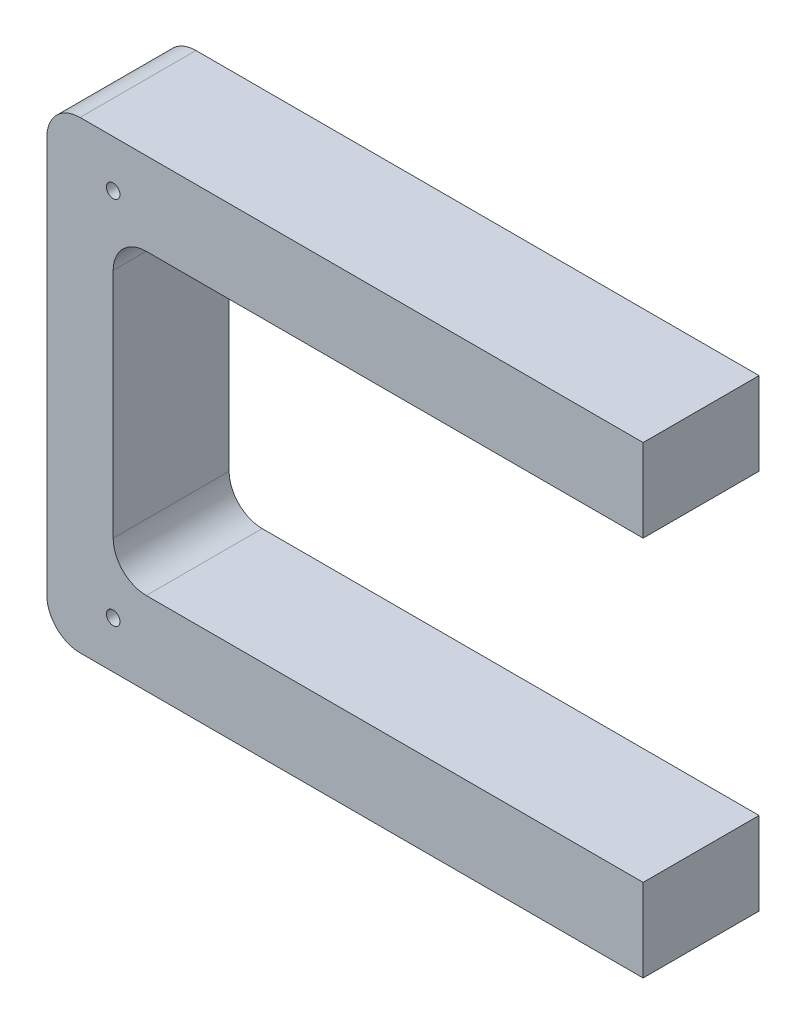
ISO-10303-21;
HEADER;
FILE_DESCRIPTION(('STEP AP214'),'2;1');
FILE_NAME('part.step','',(''),(''),'','','');
FILE_SCHEMA(('AUTOMOTIVE_DESIGN { 1 0 10303 214 1 1 1 1 }'));
ENDSEC;
DATA;
#1=APPLICATION_CONTEXT('core data for automotive mechanical design processes');
#2=APPLICATION_PROTOCOL_DEFINITION('international standard','automotive_design',2000,#1);
#3=PRODUCT_CONTEXT('',#1,'mechanical');
#4=PRODUCT('Part','Part','',(#3));
#5=PRODUCT_RELATED_PRODUCT_CATEGORY('part','',(#4));
#6=PRODUCT_DEFINITION_FORMATION('','',#4);
#7=PRODUCT_DEFINITION_CONTEXT('part definition',#1,'design');
#8=PRODUCT_DEFINITION('design','',#6,#7);
#9=PRODUCT_DEFINITION_SHAPE('','',#8);
#10=(LENGTH_UNIT() NAMED_UNIT(*) SI_UNIT(.MILLI.,.METRE.));
#11=(NAMED_UNIT(*) PLANE_ANGLE_UNIT() SI_UNIT($,.RADIAN.));
#12=(NAMED_UNIT(*) SI_UNIT($,.STERADIAN.) SOLID_ANGLE_UNIT());
#13=UNCERTAINTY_MEASURE_WITH_UNIT(LENGTH_MEASURE(1.E-05),#10,'distance_accuracy_value','');
#14=(GEOMETRIC_REPRESENTATION_CONTEXT(3) GLOBAL_UNCERTAINTY_ASSIGNED_CONTEXT((#13)) GLOBAL_UNIT_ASSIGNED_CONTEXT((#10,
#11,#12)) REPRESENTATION_CONTEXT('',''));
#15=CARTESIAN_POINT('',(0.,0.,0.));
#16=DIRECTION('',(0.,0.,1.));
#17=DIRECTION('',(1.,0.,0.));
#18=AXIS2_PLACEMENT_3D('',#15,#16,#17);
#19=CARTESIAN_POINT('',(0.,0.,35.));
#20=DIRECTION('',(0.,0.,-1.));
#21=DIRECTION('',(-1.,0.,0.));
#22=AXIS2_PLACEMENT_3D('',#19,#20,#21);
#23=PLANE('',#22);
#24=DIRECTION('',(0.,-1.,0.));
#25=VECTOR('',#24,1.);
#26=CARTESIAN_POINT('',(0.,0.,35.));
#27=LINE('',#26,#25);
#28=CARTESIAN_POINT('',(0.,130.,35.));
#29=VERTEX_POINT('',#28);
#30=CARTESIAN_POINT('',(0.,10.,35.));
#31=VERTEX_POINT('',#30);
#32=EDGE_CURVE('E140',#29,#31,#27,.T.);
#33=ORIENTED_EDGE('',*,*,#32,.T.);
#34=CARTESIAN_POINT('',(10.,10.,35.));
#35=DIRECTION('',(0.,0.,-1.));
#36=DIRECTION('',(-1.,0.,0.));
#37=AXIS2_PLACEMENT_3D('',#34,#35,#36);
#38=CIRCLE('',#37,10.);
#39=CARTESIAN_POINT('',(10.,0.,35.));
#40=VERTEX_POINT('',#39);
#41=EDGE_CURVE('E136',#31,#40,#38,.F.);
#42=ORIENTED_EDGE('',*,*,#41,.T.);
#43=DIRECTION('',(1.,0.,0.));
#44=VECTOR('',#43,1.);
#45=CARTESIAN_POINT('',(0.,0.,35.));
#46=LINE('',#45,#44);
#47=CARTESIAN_POINT('',(180.,0.,35.));
#48=VERTEX_POINT('',#47);
#49=EDGE_CURVE('E127',#40,#48,#46,.T.);
#50=ORIENTED_EDGE('',*,*,#49,.T.);
#51=DIRECTION('',(0.,1.,0.));
#52=VECTOR('',#51,1.);
#53=CARTESIAN_POINT('',(180.,0.,35.));
#54=LINE('',#53,#52);
#55=CARTESIAN_POINT('',(180.,25.,35.));
#56=VERTEX_POINT('',#55);
#57=EDGE_CURVE('E133',#48,#56,#54,.T.);
#58=ORIENTED_EDGE('',*,*,#57,.T.);
#59=DIRECTION('',(-1.,0.,0.));
#60=VECTOR('',#59,1.);
#61=CARTESIAN_POINT('',(180.,25.,35.));
#62=LINE('',#61,#60);
#63=CARTESIAN_POINT('',(30.,25.,35.));
#64=VERTEX_POINT('',#63);
#65=EDGE_CURVE('E155',#56,#64,#62,.T.);
#66=ORIENTED_EDGE('',*,*,#65,.T.);
#67=CARTESIAN_POINT('',(30.,35.,35.));
#68=DIRECTION('',(0.,0.,-1.));
#69=DIRECTION('',(-1.,0.,0.));
#70=AXIS2_PLACEMENT_3D('',#67,#68,#69);
#71=CIRCLE('',#70,10.);
#72=CARTESIAN_POINT('',(20.,35.,35.));
#73=VERTEX_POINT('',#72);
#74=EDGE_CURVE('E220',#64,#73,#71,.T.);
#75=ORIENTED_EDGE('',*,*,#74,.T.);
#76=DIRECTION('',(0.,1.,0.));
#77=VECTOR('',#76,1.);
#78=CARTESIAN_POINT('',(20.,25.,35.));
#79=LINE('',#78,#77);
#80=CARTESIAN_POINT('',(20.,105.,35.));
#81=VERTEX_POINT('',#80);
#82=EDGE_CURVE('E157',#73,#81,#79,.T.);
#83=ORIENTED_EDGE('',*,*,#82,.T.);
#84=CARTESIAN_POINT('',(30.,105.,35.));
#85=DIRECTION('',(0.,0.,-1.));
#86=DIRECTION('',(-1.,0.,0.));
#87=AXIS2_PLACEMENT_3D('',#84,#85,#86);
#88=CIRCLE('',#87,10.);
#89=CARTESIAN_POINT('',(30.,115.,35.));
#90=VERTEX_POINT('',#89);
#91=EDGE_CURVE('E11',#81,#90,#88,.T.);
#92=ORIENTED_EDGE('',*,*,#91,.T.);
#93=DIRECTION('',(1.,0.,0.));
#94=VECTOR('',#93,1.);
#95=CARTESIAN_POINT('',(180.,115.,35.));
#96=LINE('',#95,#94);
#97=CARTESIAN_POINT('',(180.,115.,35.));
#98=VERTEX_POINT('',#97);
#99=EDGE_CURVE('E162',#90,#98,#96,.T.);
#100=ORIENTED_EDGE('',*,*,#99,.T.);
#101=DIRECTION('',(0.,1.,0.));
#102=VECTOR('',#101,1.);
#103=CARTESIAN_POINT('',(180.,140.,35.));
#104=LINE('',#103,#102);
#105=CARTESIAN_POINT('',(180.,140.,35.));
#106=VERTEX_POINT('',#105);
#107=EDGE_CURVE('E164',#98,#106,#104,.T.);
#108=ORIENTED_EDGE('',*,*,#107,.T.);
#109=DIRECTION('',(-1.,0.,0.));
#110=VECTOR('',#109,1.);
#111=CARTESIAN_POINT('',(0.,140.,35.));
#112=LINE('',#111,#110);
#113=CARTESIAN_POINT('',(10.,140.,35.));
#114=VERTEX_POINT('',#113);
#115=EDGE_CURVE('E166',#106,#114,#112,.T.);
#116=ORIENTED_EDGE('',*,*,#115,.T.);
#117=CARTESIAN_POINT('',(10.,130.,35.));
#118=DIRECTION('',(0.,0.,-1.));
#119=DIRECTION('',(-1.,0.,0.));
#120=AXIS2_PLACEMENT_3D('',#117,#118,#119);
#121=CIRCLE('',#120,10.);
#122=EDGE_CURVE('E204',#114,#29,#121,.F.);
#123=ORIENTED_EDGE('',*,*,#122,.T.);
#124=EDGE_LOOP('',(#33,#42,#50,#58,#66,#75,#83,#92,#100,#108,#116,#123));
#125=FACE_BOUND('',#124,.T.);
#126=CARTESIAN_POINT('',(20.,125.8355,35.));
#127=DIRECTION('',(0.,0.,1.));
#128=DIRECTION('',(-1.,0.,0.));
#129=AXIS2_PLACEMENT_3D('',#126,#127,#128);
#130=CIRCLE('',#129,2.04999999999999);
#131=CARTESIAN_POINT('',(17.95,125.8355,35.));
#132=VERTEX_POINT('',#131);
#133=EDGE_CURVE('E172',#132,#132,#130,.T.);
#134=ORIENTED_EDGE('',*,*,#133,.F.);
#135=EDGE_LOOP('',(#134));
#136=FACE_BOUND('',#135,.T.);
#137=CARTESIAN_POINT('',(20.,14.1645,35.));
#138=DIRECTION('',(0.,0.,1.));
#139=DIRECTION('',(1.,0.,0.));
#140=AXIS2_PLACEMENT_3D('',#137,#138,#139);
#141=CIRCLE('',#140,2.05);
#142=CARTESIAN_POINT('',(22.05,14.1645,35.));
#143=VERTEX_POINT('',#142);
#144=EDGE_CURVE('E276',#143,#143,#141,.T.);
#145=ORIENTED_EDGE('',*,*,#144,.F.);
#146=EDGE_LOOP('',(#145));
#147=FACE_BOUND('',#146,.T.);
#148=ADVANCED_FACE('F39',(#125,#136,#147),#23,.F.);
#149=CARTESIAN_POINT('',(0.,0.,0.));
#150=DIRECTION('',(0.,0.,-1.));
#151=DIRECTION('',(-1.,0.,0.));
#152=AXIS2_PLACEMENT_3D('',#149,#150,#151);
#153=PLANE('',#152);
#154=CARTESIAN_POINT('',(20.,125.8355,0.));
#155=DIRECTION('',(0.,0.,1.));
#156=DIRECTION('',(-1.,0.,0.));
#157=AXIS2_PLACEMENT_3D('',#154,#155,#156);
#158=CIRCLE('',#157,2.04999999999999);
#159=CARTESIAN_POINT('',(17.95,125.8355,0.));
#160=VERTEX_POINT('',#159);
#161=EDGE_CURVE('E281',#160,#160,#158,.T.);
#162=ORIENTED_EDGE('',*,*,#161,.T.);
#163=EDGE_LOOP('',(#162));
#164=FACE_BOUND('',#163,.T.);
#165=DIRECTION('',(1.,0.,0.));
#166=VECTOR('',#165,1.);
#167=CARTESIAN_POINT('',(0.,0.,0.));
#168=LINE('',#167,#166);
#169=CARTESIAN_POINT('',(10.,0.,0.));
#170=VERTEX_POINT('',#169);
#171=CARTESIAN_POINT('',(180.,0.,0.));
#172=VERTEX_POINT('',#171);
#173=EDGE_CURVE('E146',#170,#172,#168,.T.);
#174=ORIENTED_EDGE('',*,*,#173,.F.);
#175=CARTESIAN_POINT('',(10.,10.,0.));
#176=DIRECTION('',(0.,0.,-1.));
#177=DIRECTION('',(-1.,0.,0.));
#178=AXIS2_PLACEMENT_3D('',#175,#176,#177);
#179=CIRCLE('',#178,10.);
#180=CARTESIAN_POINT('',(0.,10.,0.));
#181=VERTEX_POINT('',#180);
#182=EDGE_CURVE('E197',#170,#181,#179,.T.);
#183=ORIENTED_EDGE('',*,*,#182,.T.);
#184=DIRECTION('',(0.,-1.,0.));
#185=VECTOR('',#184,1.);
#186=CARTESIAN_POINT('',(0.,0.,0.));
#187=LINE('',#186,#185);
#188=CARTESIAN_POINT('',(0.,130.,0.));
#189=VERTEX_POINT('',#188);
#190=EDGE_CURVE('E169',#189,#181,#187,.T.);
#191=ORIENTED_EDGE('',*,*,#190,.F.);
#192=CARTESIAN_POINT('',(10.,130.,0.));
#193=DIRECTION('',(0.,0.,-1.));
#194=DIRECTION('',(-1.,0.,0.));
#195=AXIS2_PLACEMENT_3D('',#192,#193,#194);
#196=CIRCLE('',#195,10.);
#197=CARTESIAN_POINT('',(10.,140.,0.));
#198=VERTEX_POINT('',#197);
#199=EDGE_CURVE('E195',#189,#198,#196,.T.);
#200=ORIENTED_EDGE('',*,*,#199,.T.);
#201=DIRECTION('',(-1.,0.,0.));
#202=VECTOR('',#201,1.);
#203=CARTESIAN_POINT('',(0.,140.,0.));
#204=LINE('',#203,#202);
#205=CARTESIAN_POINT('',(180.,140.,0.));
#206=VERTEX_POINT('',#205);
#207=EDGE_CURVE('E186',#206,#198,#204,.T.);
#208=ORIENTED_EDGE('',*,*,#207,.F.);
#209=DIRECTION('',(0.,1.,0.));
#210=VECTOR('',#209,1.);
#211=CARTESIAN_POINT('',(180.,140.,0.));
#212=LINE('',#211,#210);
#213=CARTESIAN_POINT('',(180.,115.,0.));
#214=VERTEX_POINT('',#213);
#215=EDGE_CURVE('E184',#214,#206,#212,.T.);
#216=ORIENTED_EDGE('',*,*,#215,.F.);
#217=DIRECTION('',(1.,0.,0.));
#218=VECTOR('',#217,1.);
#219=CARTESIAN_POINT('',(180.,115.,0.));
#220=LINE('',#219,#218);
#221=CARTESIAN_POINT('',(30.,115.,0.));
#222=VERTEX_POINT('',#221);
#223=EDGE_CURVE('E182',#222,#214,#220,.T.);
#224=ORIENTED_EDGE('',*,*,#223,.F.);
#225=CARTESIAN_POINT('',(30.,105.,0.));
#226=DIRECTION('',(0.,0.,-1.));
#227=DIRECTION('',(-1.,0.,0.));
#228=AXIS2_PLACEMENT_3D('',#225,#226,#227);
#229=CIRCLE('',#228,10.);
#230=CARTESIAN_POINT('',(20.,105.,0.));
#231=VERTEX_POINT('',#230);
#232=EDGE_CURVE('E47',#222,#231,#229,.F.);
#233=ORIENTED_EDGE('',*,*,#232,.T.);
#234=DIRECTION('',(0.,1.,0.));
#235=VECTOR('',#234,1.);
#236=CARTESIAN_POINT('',(20.,25.,0.));
#237=LINE('',#236,#235);
#238=CARTESIAN_POINT('',(20.,35.,0.));
#239=VERTEX_POINT('',#238);
#240=EDGE_CURVE('E179',#239,#231,#237,.T.);
#241=ORIENTED_EDGE('',*,*,#240,.F.);
#242=CARTESIAN_POINT('',(30.,35.,0.));
#243=DIRECTION('',(0.,0.,-1.));
#244=DIRECTION('',(-1.,0.,0.));
#245=AXIS2_PLACEMENT_3D('',#242,#243,#244);
#246=CIRCLE('',#245,10.);
#247=CARTESIAN_POINT('',(30.,25.,0.));
#248=VERTEX_POINT('',#247);
#249=EDGE_CURVE('E218',#239,#248,#246,.F.);
#250=ORIENTED_EDGE('',*,*,#249,.T.);
#251=DIRECTION('',(-1.,0.,0.));
#252=VECTOR('',#251,1.);
#253=CARTESIAN_POINT('',(180.,25.,0.));
#254=LINE('',#253,#252);
#255=CARTESIAN_POINT('',(180.,25.,0.));
#256=VERTEX_POINT('',#255);
#257=EDGE_CURVE('E176',#256,#248,#254,.T.);
#258=ORIENTED_EDGE('',*,*,#257,.F.);
#259=DIRECTION('',(0.,1.,0.));
#260=VECTOR('',#259,1.);
#261=CARTESIAN_POINT('',(180.,0.,0.));
#262=LINE('',#261,#260);
#263=EDGE_CURVE('E174',#172,#256,#262,.T.);
#264=ORIENTED_EDGE('',*,*,#263,.F.);
#265=EDGE_LOOP('',(#174,#183,#191,#200,#208,#216,#224,#233,#241,#250,#258,#264));
#266=FACE_BOUND('',#265,.T.);
#267=CARTESIAN_POINT('',(20.,14.1645,0.));
#268=DIRECTION('',(0.,0.,1.));
#269=DIRECTION('',(1.,0.,0.));
#270=AXIS2_PLACEMENT_3D('',#267,#268,#269);
#271=CIRCLE('',#270,2.05);
#272=CARTESIAN_POINT('',(22.05,14.1645,0.));
#273=VERTEX_POINT('',#272);
#274=EDGE_CURVE('E279',#273,#273,#271,.T.);
#275=ORIENTED_EDGE('',*,*,#274,.T.);
#276=EDGE_LOOP('',(#275));
#277=FACE_BOUND('',#276,.T.);
#278=ADVANCED_FACE('F224',(#164,#266,#277),#153,.T.);
#279=CARTESIAN_POINT('',(0.,0.,35.));
#280=DIRECTION('',(1.,0.,0.));
#281=DIRECTION('',(0.,0.,-1.));
#282=AXIS2_PLACEMENT_3D('',#279,#280,#281);
#283=PLANE('',#282);
#284=ORIENTED_EDGE('',*,*,#190,.T.);
#285=DIRECTION('',(0.,0.,-1.));
#286=VECTOR('',#285,1.);
#287=CARTESIAN_POINT('',(0.,10.,35.));
#288=LINE('',#287,#286);
#289=EDGE_CURVE('E202',#181,#31,#288,.F.);
#290=ORIENTED_EDGE('',*,*,#289,.T.);
#291=ORIENTED_EDGE('',*,*,#32,.F.);
#292=DIRECTION('',(0.,0.,-1.));
#293=VECTOR('',#292,1.);
#294=CARTESIAN_POINT('',(0.,130.,35.));
#295=LINE('',#294,#293);
#296=EDGE_CURVE('E199',#29,#189,#295,.T.);
#297=ORIENTED_EDGE('',*,*,#296,.T.);
#298=EDGE_LOOP('',(#284,#290,#291,#297));
#299=FACE_BOUND('',#298,.T.);
#300=ADVANCED_FACE('F261',(#299),#283,.F.);
#301=CARTESIAN_POINT('',(0.,0.,35.));
#302=DIRECTION('',(0.,1.,0.));
#303=DIRECTION('',(0.,0.,1.));
#304=AXIS2_PLACEMENT_3D('',#301,#302,#303);
#305=PLANE('',#304);
#306=ORIENTED_EDGE('',*,*,#49,.F.);
#307=DIRECTION('',(0.,0.,-1.));
#308=VECTOR('',#307,1.);
#309=CARTESIAN_POINT('',(10.,0.,35.));
#310=LINE('',#309,#308);
#311=EDGE_CURVE('E149',#40,#170,#310,.T.);
#312=ORIENTED_EDGE('',*,*,#311,.T.);
#313=ORIENTED_EDGE('',*,*,#173,.T.);
#314=DIRECTION('',(0.,0.,-1.));
#315=VECTOR('',#314,1.);
#316=CARTESIAN_POINT('',(180.,0.,35.));
#317=LINE('',#316,#315);
#318=EDGE_CURVE('E143',#48,#172,#317,.T.);
#319=ORIENTED_EDGE('',*,*,#318,.F.);
#320=EDGE_LOOP('',(#306,#312,#313,#319));
#321=FACE_BOUND('',#320,.T.);
#322=ADVANCED_FACE('F144',(#321),#305,.F.);
#323=CARTESIAN_POINT('',(180.,0.,35.));
#324=DIRECTION('',(-1.,0.,0.));
#325=DIRECTION('',(0.,0.,1.));
#326=AXIS2_PLACEMENT_3D('',#323,#324,#325);
#327=PLANE('',#326);
#328=ORIENTED_EDGE('',*,*,#263,.T.);
#329=DIRECTION('',(0.,0.,-1.));
#330=VECTOR('',#329,1.);
#331=CARTESIAN_POINT('',(180.,25.,35.));
#332=LINE('',#331,#330);
#333=EDGE_CURVE('E150',#56,#256,#332,.T.);
#334=ORIENTED_EDGE('',*,*,#333,.F.);
#335=ORIENTED_EDGE('',*,*,#57,.F.);
#336=ORIENTED_EDGE('',*,*,#318,.T.);
#337=EDGE_LOOP('',(#328,#334,#335,#336));
#338=FACE_BOUND('',#337,.T.);
#339=ADVANCED_FACE('F152',(#338),#327,.F.);
#340=CARTESIAN_POINT('',(180.,25.,35.));
#341=DIRECTION('',(0.,-1.,0.));
#342=DIRECTION('',(1.,0.,0.));
#343=AXIS2_PLACEMENT_3D('',#340,#341,#342);
#344=PLANE('',#343);
#345=ORIENTED_EDGE('',*,*,#257,.T.);
#346=DIRECTION('',(0.,0.,-1.));
#347=VECTOR('',#346,1.);
#348=CARTESIAN_POINT('',(30.,25.,35.));
#349=LINE('',#348,#347);
#350=EDGE_CURVE('E213',#248,#64,#349,.F.);
#351=ORIENTED_EDGE('',*,*,#350,.T.);
#352=ORIENTED_EDGE('',*,*,#65,.F.);
#353=ORIENTED_EDGE('',*,*,#333,.T.);
#354=EDGE_LOOP('',(#345,#351,#352,#353));
#355=FACE_BOUND('',#354,.T.);
#356=ADVANCED_FACE('F294',(#355),#344,.F.);
#357=CARTESIAN_POINT('',(20.,25.,35.));
#358=DIRECTION('',(-1.,0.,0.));
#359=DIRECTION('',(0.,0.,1.));
#360=AXIS2_PLACEMENT_3D('',#357,#358,#359);
#361=PLANE('',#360);
#362=ORIENTED_EDGE('',*,*,#82,.F.);
#363=DIRECTION('',(0.,0.,-1.));
#364=VECTOR('',#363,1.);
#365=CARTESIAN_POINT('',(20.,35.,0.));
#366=LINE('',#365,#364);
#367=EDGE_CURVE('E210',#73,#239,#366,.T.);
#368=ORIENTED_EDGE('',*,*,#367,.T.);
#369=ORIENTED_EDGE('',*,*,#240,.T.);
#370=DIRECTION('',(0.,0.,-1.));
#371=VECTOR('',#370,1.);
#372=CARTESIAN_POINT('',(20.,105.,35.));
#373=LINE('',#372,#371);
#374=EDGE_CURVE('E208',#231,#81,#373,.F.);
#375=ORIENTED_EDGE('',*,*,#374,.T.);
#376=EDGE_LOOP('',(#362,#368,#369,#375));
#377=FACE_BOUND('',#376,.T.);
#378=ADVANCED_FACE('F232',(#377),#361,.F.);
#379=CARTESIAN_POINT('',(180.,115.,35.));
#380=DIRECTION('',(0.,1.,0.));
#381=DIRECTION('',(-1.,0.,0.));
#382=AXIS2_PLACEMENT_3D('',#379,#380,#381);
#383=PLANE('',#382);
#384=ORIENTED_EDGE('',*,*,#99,.F.);
#385=DIRECTION('',(0.,0.,-1.));
#386=VECTOR('',#385,1.);
#387=CARTESIAN_POINT('',(30.,115.,0.));
#388=LINE('',#387,#386);
#389=EDGE_CURVE('E215',#90,#222,#388,.T.);
#390=ORIENTED_EDGE('',*,*,#389,.T.);
#391=ORIENTED_EDGE('',*,*,#223,.T.);
#392=DIRECTION('',(0.,0.,-1.));
#393=VECTOR('',#392,1.);
#394=CARTESIAN_POINT('',(180.,115.,35.));
#395=LINE('',#394,#393);
#396=EDGE_CURVE('E190',#98,#214,#395,.T.);
#397=ORIENTED_EDGE('',*,*,#396,.F.);
#398=EDGE_LOOP('',(#384,#390,#391,#397));
#399=FACE_BOUND('',#398,.T.);
#400=ADVANCED_FACE('F235',(#399),#383,.F.);
#401=CARTESIAN_POINT('',(180.,140.,35.));
#402=DIRECTION('',(-1.,0.,0.));
#403=DIRECTION('',(0.,0.,1.));
#404=AXIS2_PLACEMENT_3D('',#401,#402,#403);
#405=PLANE('',#404);
#406=ORIENTED_EDGE('',*,*,#215,.T.);
#407=DIRECTION('',(0.,0.,-1.));
#408=VECTOR('',#407,1.);
#409=CARTESIAN_POINT('',(180.,140.,35.));
#410=LINE('',#409,#408);
#411=EDGE_CURVE('E168',#106,#206,#410,.T.);
#412=ORIENTED_EDGE('',*,*,#411,.F.);
#413=ORIENTED_EDGE('',*,*,#107,.F.);
#414=ORIENTED_EDGE('',*,*,#396,.T.);
#415=EDGE_LOOP('',(#406,#412,#413,#414));
#416=FACE_BOUND('',#415,.T.);
#417=ADVANCED_FACE('F241',(#416),#405,.F.);
#418=CARTESIAN_POINT('',(0.,140.,35.));
#419=DIRECTION('',(0.,-1.,0.));
#420=DIRECTION('',(0.,0.,-1.));
#421=AXIS2_PLACEMENT_3D('',#418,#419,#420);
#422=PLANE('',#421);
#423=ORIENTED_EDGE('',*,*,#207,.T.);
#424=DIRECTION('',(0.,0.,-1.));
#425=VECTOR('',#424,1.);
#426=CARTESIAN_POINT('',(10.,140.,35.));
#427=LINE('',#426,#425);
#428=EDGE_CURVE('E54',#198,#114,#427,.F.);
#429=ORIENTED_EDGE('',*,*,#428,.T.);
#430=ORIENTED_EDGE('',*,*,#115,.F.);
#431=ORIENTED_EDGE('',*,*,#411,.T.);
#432=EDGE_LOOP('',(#423,#429,#430,#431));
#433=FACE_BOUND('',#432,.T.);
#434=ADVANCED_FACE('F243',(#433),#422,.F.);
#435=CARTESIAN_POINT('',(20.,125.8355,35.));
#436=DIRECTION('',(0.,0.,-1.));
#437=DIRECTION('',(-1.,0.,0.));
#438=AXIS2_PLACEMENT_3D('',#435,#436,#437);
#439=CYLINDRICAL_SURFACE('',#438,2.04999999999999);
#440=ORIENTED_EDGE('',*,*,#133,.T.);
#441=EDGE_LOOP('',(#440));
#442=FACE_BOUND('',#441,.T.);
#443=ORIENTED_EDGE('',*,*,#161,.F.);
#444=EDGE_LOOP('',(#443));
#445=FACE_BOUND('',#444,.T.);
#446=ADVANCED_FACE('F245',(#442,#445),#439,.F.);
#447=CARTESIAN_POINT('',(20.,14.1645,35.));
#448=DIRECTION('',(0.,0.,-1.));
#449=DIRECTION('',(-1.,0.,0.));
#450=AXIS2_PLACEMENT_3D('',#447,#448,#449);
#451=CYLINDRICAL_SURFACE('',#450,2.05);
#452=ORIENTED_EDGE('',*,*,#144,.T.);
#453=EDGE_LOOP('',(#452));
#454=FACE_BOUND('',#453,.T.);
#455=ORIENTED_EDGE('',*,*,#274,.F.);
#456=EDGE_LOOP('',(#455));
#457=FACE_BOUND('',#456,.T.);
#458=ADVANCED_FACE('F251',(#454,#457),#451,.F.);
#459=CARTESIAN_POINT('',(10.,10.,35.));
#460=DIRECTION('',(0.,0.,-1.));
#461=DIRECTION('',(-1.,0.,0.));
#462=AXIS2_PLACEMENT_3D('',#459,#460,#461);
#463=CYLINDRICAL_SURFACE('',#462,10.);
#464=ORIENTED_EDGE('',*,*,#41,.F.);
#465=ORIENTED_EDGE('',*,*,#289,.F.);
#466=ORIENTED_EDGE('',*,*,#182,.F.);
#467=ORIENTED_EDGE('',*,*,#311,.F.);
#468=EDGE_LOOP('',(#464,#465,#466,#467));
#469=FACE_BOUND('',#468,.T.);
#470=ADVANCED_FACE('F265',(#469),#463,.T.);
#471=CARTESIAN_POINT('',(10.,130.,35.));
#472=DIRECTION('',(0.,0.,-1.));
#473=DIRECTION('',(-1.,0.,0.));
#474=AXIS2_PLACEMENT_3D('',#471,#472,#473);
#475=CYLINDRICAL_SURFACE('',#474,10.);
#476=ORIENTED_EDGE('',*,*,#122,.F.);
#477=ORIENTED_EDGE('',*,*,#428,.F.);
#478=ORIENTED_EDGE('',*,*,#199,.F.);
#479=ORIENTED_EDGE('',*,*,#296,.F.);
#480=EDGE_LOOP('',(#476,#477,#478,#479));
#481=FACE_BOUND('',#480,.T.);
#482=ADVANCED_FACE('F270',(#481),#475,.T.);
#483=CARTESIAN_POINT('',(30.,35.,35.));
#484=DIRECTION('',(0.,0.,1.));
#485=DIRECTION('',(1.,0.,0.));
#486=AXIS2_PLACEMENT_3D('',#483,#484,#485);
#487=CYLINDRICAL_SURFACE('',#486,10.);
#488=ORIENTED_EDGE('',*,*,#74,.F.);
#489=ORIENTED_EDGE('',*,*,#350,.F.);
#490=ORIENTED_EDGE('',*,*,#249,.F.);
#491=ORIENTED_EDGE('',*,*,#367,.F.);
#492=EDGE_LOOP('',(#488,#489,#490,#491));
#493=FACE_BOUND('',#492,.T.);
#494=ADVANCED_FACE('F298',(#493),#487,.F.);
#495=CARTESIAN_POINT('',(30.,105.,35.));
#496=DIRECTION('',(0.,0.,1.));
#497=DIRECTION('',(1.,0.,0.));
#498=AXIS2_PLACEMENT_3D('',#495,#496,#497);
#499=CYLINDRICAL_SURFACE('',#498,10.);
#500=ORIENTED_EDGE('',*,*,#91,.F.);
#501=ORIENTED_EDGE('',*,*,#374,.F.);
#502=ORIENTED_EDGE('',*,*,#232,.F.);
#503=ORIENTED_EDGE('',*,*,#389,.F.);
#504=EDGE_LOOP('',(#500,#501,#502,#503));
#505=FACE_BOUND('',#504,.T.);
#506=ADVANCED_FACE('F41',(#505),#499,.F.);
#507=CLOSED_SHELL('',(#148,#278,#300,#322,#339,#356,#378,#400,#417,#434,#446,#458,#470,#482,
#494,#506));
#508=MANIFOLD_SOLID_BREP('B2',#507);
#509=ADVANCED_BREP_SHAPE_REPRESENTATION('',(#18,#508),#14);
#510=SHAPE_DEFINITION_REPRESENTATION(#9,#509);
ENDSEC;
END-ISO-10303-21;
